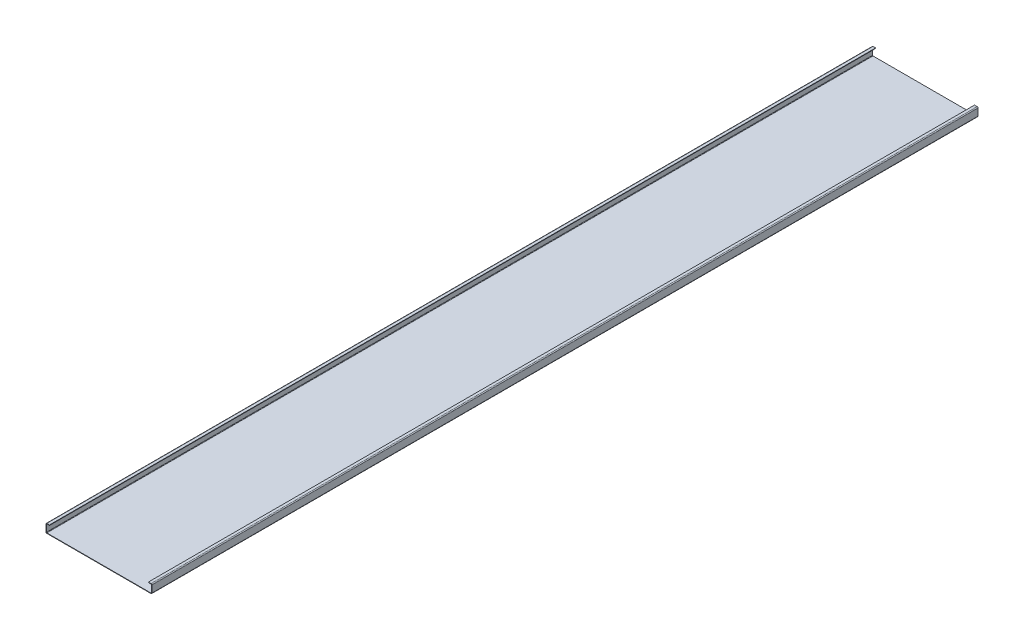
ISO-10303-21;
HEADER;
FILE_DESCRIPTION(('STEP AP214'),'2;1');
FILE_NAME('part.step','',(''),(''),'','','');
FILE_SCHEMA(('AUTOMOTIVE_DESIGN { 1 0 10303 214 1 1 1 1 }'));
ENDSEC;
DATA;
#1=APPLICATION_CONTEXT('core data for automotive mechanical design processes');
#2=APPLICATION_PROTOCOL_DEFINITION('international standard','automotive_design',2000,#1);
#3=PRODUCT_CONTEXT('',#1,'mechanical');
#4=PRODUCT('Part','Part','',(#3));
#5=PRODUCT_RELATED_PRODUCT_CATEGORY('part','',(#4));
#6=PRODUCT_DEFINITION_FORMATION('','',#4);
#7=PRODUCT_DEFINITION_CONTEXT('part definition',#1,'design');
#8=PRODUCT_DEFINITION('design','',#6,#7);
#9=PRODUCT_DEFINITION_SHAPE('','',#8);
#10=(LENGTH_UNIT() NAMED_UNIT(*) SI_UNIT(.MILLI.,.METRE.));
#11=(NAMED_UNIT(*) PLANE_ANGLE_UNIT() SI_UNIT($,.RADIAN.));
#12=(NAMED_UNIT(*) SI_UNIT($,.STERADIAN.) SOLID_ANGLE_UNIT());
#13=UNCERTAINTY_MEASURE_WITH_UNIT(LENGTH_MEASURE(1.E-05),#10,'distance_accuracy_value','');
#14=(GEOMETRIC_REPRESENTATION_CONTEXT(3) GLOBAL_UNCERTAINTY_ASSIGNED_CONTEXT((#13)) GLOBAL_UNIT_ASSIGNED_CONTEXT((#10,
#11,#12)) REPRESENTATION_CONTEXT('',''));
#15=CARTESIAN_POINT('',(0.,0.,0.));
#16=DIRECTION('',(0.,0.,1.));
#17=DIRECTION('',(1.,0.,0.));
#18=AXIS2_PLACEMENT_3D('',#15,#16,#17);
#19=CARTESIAN_POINT('',(2.5,25.,2380.));
#20=DIRECTION('',(0.,0.,1.));
#21=DIRECTION('',(1.,0.,0.));
#22=AXIS2_PLACEMENT_3D('',#19,#20,#21);
#23=PLANE('',#22);
#24=DIRECTION('',(0.,-1.,0.));
#25=VECTOR('',#24,1.);
#26=CARTESIAN_POINT('',(2.5,25.,2380.));
#27=LINE('',#26,#25);
#28=CARTESIAN_POINT('',(2.5,25.,2380.));
#29=VERTEX_POINT('',#28);
#30=CARTESIAN_POINT('',(2.5,23.75,2380.));
#31=VERTEX_POINT('',#30);
#32=EDGE_CURVE('E11',#29,#31,#27,.T.);
#33=ORIENTED_EDGE('',*,*,#32,.F.);
#34=CARTESIAN_POINT('',(2.5,22.5,2380.));
#35=DIRECTION('',(0.,0.,-1.));
#36=DIRECTION('',(-1.,0.,0.));
#37=AXIS2_PLACEMENT_3D('',#34,#35,#36);
#38=CIRCLE('',#37,2.5);
#39=CARTESIAN_POINT('',(0.,22.5,2380.));
#40=VERTEX_POINT('',#39);
#41=EDGE_CURVE('E364',#29,#40,#38,.F.);
#42=ORIENTED_EDGE('',*,*,#41,.T.);
#43=DIRECTION('',(-1.,0.,0.));
#44=VECTOR('',#43,1.);
#45=CARTESIAN_POINT('',(1.25,22.5,2380.));
#46=LINE('',#45,#44);
#47=CARTESIAN_POINT('',(1.25,22.5,2380.));
#48=VERTEX_POINT('',#47);
#49=EDGE_CURVE('E47',#48,#40,#46,.T.);
#50=ORIENTED_EDGE('',*,*,#49,.F.);
#51=CARTESIAN_POINT('',(2.5,22.5,2380.));
#52=DIRECTION('',(0.,0.,1.));
#53=DIRECTION('',(1.,0.,0.));
#54=AXIS2_PLACEMENT_3D('',#51,#52,#53);
#55=CIRCLE('',#54,1.25);
#56=EDGE_CURVE('E439',#31,#48,#55,.T.);
#57=ORIENTED_EDGE('',*,*,#56,.F.);
#58=EDGE_LOOP('',(#33,#42,#50,#57));
#59=FACE_BOUND('',#58,.T.);
#60=ADVANCED_FACE('F39',(#59),#23,.T.);
#61=CARTESIAN_POINT('',(1.25,22.5,2380.));
#62=DIRECTION('',(0.,0.,1.));
#63=DIRECTION('',(1.,0.,0.));
#64=AXIS2_PLACEMENT_3D('',#61,#62,#63);
#65=PLANE('',#64);
#66=DIRECTION('',(-1.,0.,0.));
#67=VECTOR('',#66,1.);
#68=CARTESIAN_POINT('',(10.,25.,2380.));
#69=LINE('',#68,#67);
#70=CARTESIAN_POINT('',(10.,25.,2380.));
#71=VERTEX_POINT('',#70);
#72=EDGE_CURVE('E368',#71,#29,#69,.T.);
#73=ORIENTED_EDGE('',*,*,#72,.T.);
#74=ORIENTED_EDGE('',*,*,#32,.T.);
#75=DIRECTION('',(1.,0.,0.));
#76=VECTOR('',#75,1.);
#77=CARTESIAN_POINT('',(10.,23.75,2380.));
#78=LINE('',#77,#76);
#79=CARTESIAN_POINT('',(10.,23.75,2380.));
#80=VERTEX_POINT('',#79);
#81=EDGE_CURVE('E441',#80,#31,#78,.F.);
#82=ORIENTED_EDGE('',*,*,#81,.F.);
#83=DIRECTION('',(0.,-1.,0.));
#84=VECTOR('',#83,1.);
#85=CARTESIAN_POINT('',(10.,25.,2380.));
#86=LINE('',#85,#84);
#87=EDGE_CURVE('E444',#71,#80,#86,.T.);
#88=ORIENTED_EDGE('',*,*,#87,.F.);
#89=EDGE_LOOP('',(#73,#74,#82,#88));
#90=FACE_BOUND('',#89,.T.);
#91=ADVANCED_FACE('F450',(#90),#65,.T.);
#92=CARTESIAN_POINT('',(0.,22.5,0.));
#93=DIRECTION('',(0.,0.,-1.));
#94=DIRECTION('',(-1.,0.,0.));
#95=AXIS2_PLACEMENT_3D('',#92,#93,#94);
#96=PLANE('',#95);
#97=DIRECTION('',(1.,0.,0.));
#98=VECTOR('',#97,1.);
#99=CARTESIAN_POINT('',(0.,22.5,0.));
#100=LINE('',#99,#98);
#101=CARTESIAN_POINT('',(0.,22.5,0.));
#102=VERTEX_POINT('',#101);
#103=CARTESIAN_POINT('',(1.25,22.5,0.));
#104=VERTEX_POINT('',#103);
#105=EDGE_CURVE('E348',#102,#104,#100,.T.);
#106=ORIENTED_EDGE('',*,*,#105,.F.);
#107=CARTESIAN_POINT('',(2.5,22.5,0.));
#108=DIRECTION('',(0.,0.,-1.));
#109=DIRECTION('',(-1.,0.,0.));
#110=AXIS2_PLACEMENT_3D('',#107,#108,#109);
#111=CIRCLE('',#110,2.5);
#112=CARTESIAN_POINT('',(2.5,25.,0.));
#113=VERTEX_POINT('',#112);
#114=EDGE_CURVE('E264',#113,#102,#111,.F.);
#115=ORIENTED_EDGE('',*,*,#114,.F.);
#116=DIRECTION('',(0.,1.,0.));
#117=VECTOR('',#116,1.);
#118=CARTESIAN_POINT('',(2.5,23.75,0.));
#119=LINE('',#118,#117);
#120=CARTESIAN_POINT('',(2.5,23.75,0.));
#121=VERTEX_POINT('',#120);
#122=EDGE_CURVE('E346',#121,#113,#119,.T.);
#123=ORIENTED_EDGE('',*,*,#122,.F.);
#124=CARTESIAN_POINT('',(2.5,22.5,0.));
#125=DIRECTION('',(0.,0.,1.));
#126=DIRECTION('',(1.,0.,0.));
#127=AXIS2_PLACEMENT_3D('',#124,#125,#126);
#128=CIRCLE('',#127,1.25);
#129=EDGE_CURVE('E252',#121,#104,#128,.T.);
#130=ORIENTED_EDGE('',*,*,#129,.T.);
#131=EDGE_LOOP('',(#106,#115,#123,#130));
#132=FACE_BOUND('',#131,.T.);
#133=ADVANCED_FACE('F457',(#132),#96,.T.);
#134=CARTESIAN_POINT('',(2.5,23.75,0.));
#135=DIRECTION('',(0.,0.,-1.));
#136=DIRECTION('',(-1.,0.,0.));
#137=AXIS2_PLACEMENT_3D('',#134,#135,#136);
#138=PLANE('',#137);
#139=DIRECTION('',(0.,-1.,0.));
#140=VECTOR('',#139,1.);
#141=CARTESIAN_POINT('',(0.,25.,0.));
#142=LINE('',#141,#140);
#143=CARTESIAN_POINT('',(0.,2.5,0.));
#144=VERTEX_POINT('',#143);
#145=EDGE_CURVE('E267',#102,#144,#142,.T.);
#146=ORIENTED_EDGE('',*,*,#145,.F.);
#147=ORIENTED_EDGE('',*,*,#105,.T.);
#148=DIRECTION('',(0.,1.,0.));
#149=VECTOR('',#148,1.);
#150=CARTESIAN_POINT('',(1.25,25.,0.));
#151=LINE('',#150,#149);
#152=CARTESIAN_POINT('',(1.25,2.5,0.));
#153=VERTEX_POINT('',#152);
#154=EDGE_CURVE('E249',#104,#153,#151,.F.);
#155=ORIENTED_EDGE('',*,*,#154,.T.);
#156=DIRECTION('',(-1.,0.,0.));
#157=VECTOR('',#156,1.);
#158=CARTESIAN_POINT('',(1.25,2.5,0.));
#159=LINE('',#158,#157);
#160=EDGE_CURVE('E338',#153,#144,#159,.T.);
#161=ORIENTED_EDGE('',*,*,#160,.T.);
#162=EDGE_LOOP('',(#146,#147,#155,#161));
#163=FACE_BOUND('',#162,.T.);
#164=ADVANCED_FACE('F460',(#163),#138,.T.);
#165=CARTESIAN_POINT('',(0.,2.5,2380.));
#166=DIRECTION('',(0.,0.,1.));
#167=DIRECTION('',(1.,0.,0.));
#168=AXIS2_PLACEMENT_3D('',#165,#166,#167);
#169=PLANE('',#168);
#170=DIRECTION('',(1.,0.,0.));
#171=VECTOR('',#170,1.);
#172=CARTESIAN_POINT('',(0.,2.5,2380.));
#173=LINE('',#172,#171);
#174=CARTESIAN_POINT('',(0.,2.5,2380.));
#175=VERTEX_POINT('',#174);
#176=CARTESIAN_POINT('',(1.25,2.5,2380.));
#177=VERTEX_POINT('',#176);
#178=EDGE_CURVE('E344',#175,#177,#173,.T.);
#179=ORIENTED_EDGE('',*,*,#178,.F.);
#180=CARTESIAN_POINT('',(2.5,2.5,2380.));
#181=DIRECTION('',(0.,0.,-1.));
#182=DIRECTION('',(-1.,0.,0.));
#183=AXIS2_PLACEMENT_3D('',#180,#181,#182);
#184=CIRCLE('',#183,2.5);
#185=CARTESIAN_POINT('',(2.5,0.,2380.));
#186=VERTEX_POINT('',#185);
#187=EDGE_CURVE('E376',#175,#186,#184,.F.);
#188=ORIENTED_EDGE('',*,*,#187,.T.);
#189=DIRECTION('',(0.,-1.,0.));
#190=VECTOR('',#189,1.);
#191=CARTESIAN_POINT('',(2.5,1.25,2380.));
#192=LINE('',#191,#190);
#193=CARTESIAN_POINT('',(2.5,1.25,2380.));
#194=VERTEX_POINT('',#193);
#195=EDGE_CURVE('E342',#194,#186,#192,.T.);
#196=ORIENTED_EDGE('',*,*,#195,.F.);
#197=CARTESIAN_POINT('',(2.5,2.5,2380.));
#198=DIRECTION('',(0.,0.,1.));
#199=DIRECTION('',(1.,0.,0.));
#200=AXIS2_PLACEMENT_3D('',#197,#198,#199);
#201=CIRCLE('',#200,1.25);
#202=EDGE_CURVE('E435',#177,#194,#201,.T.);
#203=ORIENTED_EDGE('',*,*,#202,.F.);
#204=EDGE_LOOP('',(#179,#188,#196,#203));
#205=FACE_BOUND('',#204,.T.);
#206=ADVANCED_FACE('F480',(#205),#169,.T.);
#207=CARTESIAN_POINT('',(2.5,1.25,2380.));
#208=DIRECTION('',(0.,0.,1.));
#209=DIRECTION('',(1.,0.,0.));
#210=AXIS2_PLACEMENT_3D('',#207,#208,#209);
#211=PLANE('',#210);
#212=DIRECTION('',(0.,-1.,0.));
#213=VECTOR('',#212,1.);
#214=CARTESIAN_POINT('',(0.,25.,2380.));
#215=LINE('',#214,#213);
#216=EDGE_CURVE('E355',#40,#175,#215,.T.);
#217=ORIENTED_EDGE('',*,*,#216,.T.);
#218=ORIENTED_EDGE('',*,*,#178,.T.);
#219=DIRECTION('',(0.,1.,0.));
#220=VECTOR('',#219,1.);
#221=CARTESIAN_POINT('',(1.25,25.,2380.));
#222=LINE('',#221,#220);
#223=EDGE_CURVE('E358',#48,#177,#222,.F.);
#224=ORIENTED_EDGE('',*,*,#223,.F.);
#225=ORIENTED_EDGE('',*,*,#49,.T.);
#226=EDGE_LOOP('',(#217,#218,#224,#225));
#227=FACE_BOUND('',#226,.T.);
#228=ADVANCED_FACE('F353',(#227),#211,.T.);
#229=CARTESIAN_POINT('',(2.5,0.,0.));
#230=DIRECTION('',(0.,0.,-1.));
#231=DIRECTION('',(-1.,0.,0.));
#232=AXIS2_PLACEMENT_3D('',#229,#230,#231);
#233=PLANE('',#232);
#234=DIRECTION('',(0.,1.,0.));
#235=VECTOR('',#234,1.);
#236=CARTESIAN_POINT('',(2.5,0.,0.));
#237=LINE('',#236,#235);
#238=CARTESIAN_POINT('',(2.5,0.,0.));
#239=VERTEX_POINT('',#238);
#240=CARTESIAN_POINT('',(2.5,1.25,0.));
#241=VERTEX_POINT('',#240);
#242=EDGE_CURVE('E340',#239,#241,#237,.T.);
#243=ORIENTED_EDGE('',*,*,#242,.F.);
#244=CARTESIAN_POINT('',(2.5,2.5,0.));
#245=DIRECTION('',(0.,0.,-1.));
#246=DIRECTION('',(-1.,0.,0.));
#247=AXIS2_PLACEMENT_3D('',#244,#245,#246);
#248=CIRCLE('',#247,2.5);
#249=EDGE_CURVE('E270',#144,#239,#248,.F.);
#250=ORIENTED_EDGE('',*,*,#249,.F.);
#251=ORIENTED_EDGE('',*,*,#160,.F.);
#252=CARTESIAN_POINT('',(2.5,2.5,0.));
#253=DIRECTION('',(0.,0.,1.));
#254=DIRECTION('',(1.,0.,0.));
#255=AXIS2_PLACEMENT_3D('',#252,#253,#254);
#256=CIRCLE('',#255,1.25);
#257=EDGE_CURVE('E246',#153,#241,#256,.T.);
#258=ORIENTED_EDGE('',*,*,#257,.T.);
#259=EDGE_LOOP('',(#243,#250,#251,#258));
#260=FACE_BOUND('',#259,.T.);
#261=ADVANCED_FACE('F474',(#260),#233,.T.);
#262=CARTESIAN_POINT('',(1.25,2.5,0.));
#263=DIRECTION('',(0.,0.,-1.));
#264=DIRECTION('',(-1.,0.,0.));
#265=AXIS2_PLACEMENT_3D('',#262,#263,#264);
#266=PLANE('',#265);
#267=DIRECTION('',(1.,0.,0.));
#268=VECTOR('',#267,1.);
#269=CARTESIAN_POINT('',(0.,0.,0.));
#270=LINE('',#269,#268);
#271=CARTESIAN_POINT('',(302.5,0.,0.));
#272=VERTEX_POINT('',#271);
#273=EDGE_CURVE('E273',#239,#272,#270,.T.);
#274=ORIENTED_EDGE('',*,*,#273,.F.);
#275=ORIENTED_EDGE('',*,*,#242,.T.);
#276=DIRECTION('',(1.,0.,0.));
#277=VECTOR('',#276,1.);
#278=CARTESIAN_POINT('',(0.,1.25,0.));
#279=LINE('',#278,#277);
#280=CARTESIAN_POINT('',(302.5,1.25,0.));
#281=VERTEX_POINT('',#280);
#282=EDGE_CURVE('E243',#241,#281,#279,.T.);
#283=ORIENTED_EDGE('',*,*,#282,.T.);
#284=DIRECTION('',(0.,-1.,0.));
#285=VECTOR('',#284,1.);
#286=CARTESIAN_POINT('',(302.5,1.25,0.));
#287=LINE('',#286,#285);
#288=EDGE_CURVE('E334',#281,#272,#287,.T.);
#289=ORIENTED_EDGE('',*,*,#288,.T.);
#290=EDGE_LOOP('',(#274,#275,#283,#289));
#291=FACE_BOUND('',#290,.T.);
#292=ADVANCED_FACE('F484',(#291),#266,.T.);
#293=CARTESIAN_POINT('',(302.5,0.,2380.));
#294=DIRECTION('',(0.,0.,1.));
#295=DIRECTION('',(1.,0.,0.));
#296=AXIS2_PLACEMENT_3D('',#293,#294,#295);
#297=PLANE('',#296);
#298=DIRECTION('',(0.,1.,0.));
#299=VECTOR('',#298,1.);
#300=CARTESIAN_POINT('',(302.5,0.,2380.));
#301=LINE('',#300,#299);
#302=CARTESIAN_POINT('',(302.5,0.,2380.));
#303=VERTEX_POINT('',#302);
#304=CARTESIAN_POINT('',(302.5,1.25,2380.));
#305=VERTEX_POINT('',#304);
#306=EDGE_CURVE('E196',#303,#305,#301,.T.);
#307=ORIENTED_EDGE('',*,*,#306,.F.);
#308=CARTESIAN_POINT('',(302.5,2.5,2380.));
#309=DIRECTION('',(0.,0.,-1.));
#310=DIRECTION('',(-1.,0.,0.));
#311=AXIS2_PLACEMENT_3D('',#308,#309,#310);
#312=CIRCLE('',#311,2.5);
#313=CARTESIAN_POINT('',(305.,2.5,2380.));
#314=VERTEX_POINT('',#313);
#315=EDGE_CURVE('E200',#303,#314,#312,.F.);
#316=ORIENTED_EDGE('',*,*,#315,.T.);
#317=DIRECTION('',(1.,0.,0.));
#318=VECTOR('',#317,1.);
#319=CARTESIAN_POINT('',(303.75,2.5,2380.));
#320=LINE('',#319,#318);
#321=CARTESIAN_POINT('',(303.75,2.5,2380.));
#322=VERTEX_POINT('',#321);
#323=EDGE_CURVE('E184',#322,#314,#320,.T.);
#324=ORIENTED_EDGE('',*,*,#323,.F.);
#325=CARTESIAN_POINT('',(302.5,2.5,2380.));
#326=DIRECTION('',(0.,0.,1.));
#327=DIRECTION('',(1.,0.,0.));
#328=AXIS2_PLACEMENT_3D('',#325,#326,#327);
#329=CIRCLE('',#328,1.25);
#330=EDGE_CURVE('E397',#305,#322,#329,.T.);
#331=ORIENTED_EDGE('',*,*,#330,.F.);
#332=EDGE_LOOP('',(#307,#316,#324,#331));
#333=FACE_BOUND('',#332,.T.);
#334=ADVANCED_FACE('F202',(#333),#297,.T.);
#335=CARTESIAN_POINT('',(303.75,2.5,2380.));
#336=DIRECTION('',(0.,0.,1.));
#337=DIRECTION('',(1.,0.,0.));
#338=AXIS2_PLACEMENT_3D('',#335,#336,#337);
#339=PLANE('',#338);
#340=DIRECTION('',(1.,0.,0.));
#341=VECTOR('',#340,1.);
#342=CARTESIAN_POINT('',(0.,0.,2380.));
#343=LINE('',#342,#341);
#344=EDGE_CURVE('E206',#186,#303,#343,.T.);
#345=ORIENTED_EDGE('',*,*,#344,.T.);
#346=ORIENTED_EDGE('',*,*,#306,.T.);
#347=DIRECTION('',(1.,0.,0.));
#348=VECTOR('',#347,1.);
#349=CARTESIAN_POINT('',(0.,1.25,2380.));
#350=LINE('',#349,#348);
#351=EDGE_CURVE('E432',#194,#305,#350,.T.);
#352=ORIENTED_EDGE('',*,*,#351,.F.);
#353=ORIENTED_EDGE('',*,*,#195,.T.);
#354=EDGE_LOOP('',(#345,#346,#352,#353));
#355=FACE_BOUND('',#354,.T.);
#356=ADVANCED_FACE('F384',(#355),#339,.T.);
#357=CARTESIAN_POINT('',(305.,2.5,0.));
#358=DIRECTION('',(0.,0.,-1.));
#359=DIRECTION('',(-1.,0.,0.));
#360=AXIS2_PLACEMENT_3D('',#357,#358,#359);
#361=PLANE('',#360);
#362=DIRECTION('',(-1.,0.,0.));
#363=VECTOR('',#362,1.);
#364=CARTESIAN_POINT('',(305.,2.5,0.));
#365=LINE('',#364,#363);
#366=CARTESIAN_POINT('',(305.,2.5,0.));
#367=VERTEX_POINT('',#366);
#368=CARTESIAN_POINT('',(303.75,2.5,0.));
#369=VERTEX_POINT('',#368);
#370=EDGE_CURVE('E197',#367,#369,#365,.T.);
#371=ORIENTED_EDGE('',*,*,#370,.F.);
#372=CARTESIAN_POINT('',(302.5,2.5,0.));
#373=DIRECTION('',(0.,0.,-1.));
#374=DIRECTION('',(-1.,0.,0.));
#375=AXIS2_PLACEMENT_3D('',#372,#373,#374);
#376=CIRCLE('',#375,2.5);
#377=EDGE_CURVE('E213',#272,#367,#376,.F.);
#378=ORIENTED_EDGE('',*,*,#377,.F.);
#379=ORIENTED_EDGE('',*,*,#288,.F.);
#380=CARTESIAN_POINT('',(302.5,2.5,0.));
#381=DIRECTION('',(0.,0.,1.));
#382=DIRECTION('',(1.,0.,0.));
#383=AXIS2_PLACEMENT_3D('',#380,#381,#382);
#384=CIRCLE('',#383,1.25);
#385=EDGE_CURVE('E240',#281,#369,#384,.T.);
#386=ORIENTED_EDGE('',*,*,#385,.T.);
#387=EDGE_LOOP('',(#371,#378,#379,#386));
#388=FACE_BOUND('',#387,.T.);
#389=ADVANCED_FACE('F391',(#388),#361,.T.);
#390=CARTESIAN_POINT('',(302.5,1.25,0.));
#391=DIRECTION('',(0.,0.,-1.));
#392=DIRECTION('',(-1.,0.,0.));
#393=AXIS2_PLACEMENT_3D('',#390,#391,#392);
#394=PLANE('',#393);
#395=DIRECTION('',(0.,1.,0.));
#396=VECTOR('',#395,1.);
#397=CARTESIAN_POINT('',(305.,0.,0.));
#398=LINE('',#397,#396);
#399=CARTESIAN_POINT('',(305.,22.5,0.));
#400=VERTEX_POINT('',#399);
#401=EDGE_CURVE('E277',#367,#400,#398,.T.);
#402=ORIENTED_EDGE('',*,*,#401,.F.);
#403=ORIENTED_EDGE('',*,*,#370,.T.);
#404=DIRECTION('',(0.,1.,0.));
#405=VECTOR('',#404,1.);
#406=CARTESIAN_POINT('',(303.75,0.,0.));
#407=LINE('',#406,#405);
#408=CARTESIAN_POINT('',(303.75,22.5,0.));
#409=VERTEX_POINT('',#408);
#410=EDGE_CURVE('E238',#369,#409,#407,.T.);
#411=ORIENTED_EDGE('',*,*,#410,.T.);
#412=DIRECTION('',(1.,0.,0.));
#413=VECTOR('',#412,1.);
#414=CARTESIAN_POINT('',(303.75,22.5,0.));
#415=LINE('',#414,#413);
#416=EDGE_CURVE('E120',#409,#400,#415,.T.);
#417=ORIENTED_EDGE('',*,*,#416,.T.);
#418=EDGE_LOOP('',(#402,#403,#411,#417));
#419=FACE_BOUND('',#418,.T.);
#420=ADVANCED_FACE('F393',(#419),#394,.T.);
#421=CARTESIAN_POINT('',(305.,22.5,2380.));
#422=DIRECTION('',(0.,0.,1.));
#423=DIRECTION('',(1.,0.,0.));
#424=AXIS2_PLACEMENT_3D('',#421,#422,#423);
#425=PLANE('',#424);
#426=DIRECTION('',(-1.,0.,0.));
#427=VECTOR('',#426,1.);
#428=CARTESIAN_POINT('',(305.,22.5,2380.));
#429=LINE('',#428,#427);
#430=CARTESIAN_POINT('',(305.,22.5,2380.));
#431=VERTEX_POINT('',#430);
#432=CARTESIAN_POINT('',(303.75,22.5,2380.));
#433=VERTEX_POINT('',#432);
#434=EDGE_CURVE('E332',#431,#433,#429,.T.);
#435=ORIENTED_EDGE('',*,*,#434,.F.);
#436=CARTESIAN_POINT('',(302.5,22.5,2380.));
#437=DIRECTION('',(0.,0.,-1.));
#438=DIRECTION('',(-1.,0.,0.));
#439=AXIS2_PLACEMENT_3D('',#436,#437,#438);
#440=CIRCLE('',#439,2.5);
#441=CARTESIAN_POINT('',(302.5,25.,2380.));
#442=VERTEX_POINT('',#441);
#443=EDGE_CURVE('E221',#431,#442,#440,.F.);
#444=ORIENTED_EDGE('',*,*,#443,.T.);
#445=DIRECTION('',(0.,1.,0.));
#446=VECTOR('',#445,1.);
#447=CARTESIAN_POINT('',(302.5,23.75,2380.));
#448=LINE('',#447,#446);
#449=CARTESIAN_POINT('',(302.5,23.75,2380.));
#450=VERTEX_POINT('',#449);
#451=EDGE_CURVE('E55',#450,#442,#448,.T.);
#452=ORIENTED_EDGE('',*,*,#451,.F.);
#453=CARTESIAN_POINT('',(302.5,22.5,2380.));
#454=DIRECTION('',(0.,0.,1.));
#455=DIRECTION('',(1.,0.,0.));
#456=AXIS2_PLACEMENT_3D('',#453,#454,#455);
#457=CIRCLE('',#456,1.25);
#458=EDGE_CURVE('E425',#433,#450,#457,.T.);
#459=ORIENTED_EDGE('',*,*,#458,.F.);
#460=EDGE_LOOP('',(#435,#444,#452,#459));
#461=FACE_BOUND('',#460,.T.);
#462=ADVANCED_FACE('F555',(#461),#425,.T.);
#463=CARTESIAN_POINT('',(302.5,23.75,2380.));
#464=DIRECTION('',(0.,0.,1.));
#465=DIRECTION('',(1.,0.,0.));
#466=AXIS2_PLACEMENT_3D('',#463,#464,#465);
#467=PLANE('',#466);
#468=DIRECTION('',(0.,1.,0.));
#469=VECTOR('',#468,1.);
#470=CARTESIAN_POINT('',(305.,0.,2380.));
#471=LINE('',#470,#469);
#472=EDGE_CURVE('E188',#314,#431,#471,.T.);
#473=ORIENTED_EDGE('',*,*,#472,.T.);
#474=ORIENTED_EDGE('',*,*,#434,.T.);
#475=DIRECTION('',(0.,1.,0.));
#476=VECTOR('',#475,1.);
#477=CARTESIAN_POINT('',(303.75,0.,2380.));
#478=LINE('',#477,#476);
#479=EDGE_CURVE('E191',#322,#433,#478,.T.);
#480=ORIENTED_EDGE('',*,*,#479,.F.);
#481=ORIENTED_EDGE('',*,*,#323,.T.);
#482=EDGE_LOOP('',(#473,#474,#480,#481));
#483=FACE_BOUND('',#482,.T.);
#484=ADVANCED_FACE('F186',(#483),#467,.T.);
#485=CARTESIAN_POINT('',(302.5,25.,0.));
#486=DIRECTION('',(0.,0.,-1.));
#487=DIRECTION('',(-1.,0.,0.));
#488=AXIS2_PLACEMENT_3D('',#485,#486,#487);
#489=PLANE('',#488);
#490=DIRECTION('',(0.,-1.,0.));
#491=VECTOR('',#490,1.);
#492=CARTESIAN_POINT('',(302.5,25.,0.));
#493=LINE('',#492,#491);
#494=CARTESIAN_POINT('',(302.5,25.,0.));
#495=VERTEX_POINT('',#494);
#496=CARTESIAN_POINT('',(302.5,23.75,0.));
#497=VERTEX_POINT('',#496);
#498=EDGE_CURVE('E127',#495,#497,#493,.T.);
#499=ORIENTED_EDGE('',*,*,#498,.F.);
#500=CARTESIAN_POINT('',(302.5,22.5,0.));
#501=DIRECTION('',(0.,0.,-1.));
#502=DIRECTION('',(-1.,0.,0.));
#503=AXIS2_PLACEMENT_3D('',#500,#501,#502);
#504=CIRCLE('',#503,2.5);
#505=EDGE_CURVE('E279',#400,#495,#504,.F.);
#506=ORIENTED_EDGE('',*,*,#505,.F.);
#507=ORIENTED_EDGE('',*,*,#416,.F.);
#508=CARTESIAN_POINT('',(302.5,22.5,0.));
#509=DIRECTION('',(0.,0.,1.));
#510=DIRECTION('',(1.,0.,0.));
#511=AXIS2_PLACEMENT_3D('',#508,#509,#510);
#512=CIRCLE('',#511,1.25);
#513=EDGE_CURVE('E236',#409,#497,#512,.T.);
#514=ORIENTED_EDGE('',*,*,#513,.T.);
#515=EDGE_LOOP('',(#499,#506,#507,#514));
#516=FACE_BOUND('',#515,.T.);
#517=ADVANCED_FACE('F408',(#516),#489,.T.);
#518=CARTESIAN_POINT('',(303.75,22.5,0.));
#519=DIRECTION('',(0.,0.,-1.));
#520=DIRECTION('',(-1.,0.,0.));
#521=AXIS2_PLACEMENT_3D('',#518,#519,#520);
#522=PLANE('',#521);
#523=DIRECTION('',(-1.,0.,0.));
#524=VECTOR('',#523,1.);
#525=CARTESIAN_POINT('',(305.,25.,0.));
#526=LINE('',#525,#524);
#527=CARTESIAN_POINT('',(295.,25.,0.));
#528=VERTEX_POINT('',#527);
#529=EDGE_CURVE('E227',#495,#528,#526,.T.);
#530=ORIENTED_EDGE('',*,*,#529,.F.);
#531=ORIENTED_EDGE('',*,*,#498,.T.);
#532=DIRECTION('',(1.,0.,0.));
#533=VECTOR('',#532,1.);
#534=CARTESIAN_POINT('',(305.,23.75,0.));
#535=LINE('',#534,#533);
#536=CARTESIAN_POINT('',(295.,23.75,0.));
#537=VERTEX_POINT('',#536);
#538=EDGE_CURVE('E233',#497,#537,#535,.F.);
#539=ORIENTED_EDGE('',*,*,#538,.T.);
#540=DIRECTION('',(0.,1.,0.));
#541=VECTOR('',#540,1.);
#542=CARTESIAN_POINT('',(295.,23.75,0.));
#543=LINE('',#542,#541);
#544=EDGE_CURVE('E230',#537,#528,#543,.T.);
#545=ORIENTED_EDGE('',*,*,#544,.T.);
#546=EDGE_LOOP('',(#530,#531,#539,#545));
#547=FACE_BOUND('',#546,.T.);
#548=ADVANCED_FACE('F416',(#547),#522,.T.);
#549=CARTESIAN_POINT('',(305.,25.,2380.));
#550=DIRECTION('',(0.,-1.,0.));
#551=DIRECTION('',(0.,0.,-1.));
#552=AXIS2_PLACEMENT_3D('',#549,#550,#551);
#553=PLANE('',#552);
#554=ORIENTED_EDGE('',*,*,#529,.T.);
#555=DIRECTION('',(0.,0.,-1.));
#556=VECTOR('',#555,1.);
#557=CARTESIAN_POINT('',(295.,25.,2380.));
#558=LINE('',#557,#556);
#559=CARTESIAN_POINT('',(295.,25.,2380.));
#560=VERTEX_POINT('',#559);
#561=EDGE_CURVE('E327',#560,#528,#558,.T.);
#562=ORIENTED_EDGE('',*,*,#561,.F.);
#563=DIRECTION('',(-1.,0.,0.));
#564=VECTOR('',#563,1.);
#565=CARTESIAN_POINT('',(305.,25.,2380.));
#566=LINE('',#565,#564);
#567=EDGE_CURVE('E133',#442,#560,#566,.T.);
#568=ORIENTED_EDGE('',*,*,#567,.F.);
#569=DIRECTION('',(0.,0.,-1.));
#570=VECTOR('',#569,1.);
#571=CARTESIAN_POINT('',(302.5,25.,2380.));
#572=LINE('',#571,#570);
#573=EDGE_CURVE('E223',#442,#495,#572,.T.);
#574=ORIENTED_EDGE('',*,*,#573,.T.);
#575=EDGE_LOOP('',(#554,#562,#568,#574));
#576=FACE_BOUND('',#575,.T.);
#577=ADVANCED_FACE('F414',(#576),#553,.F.);
#578=CARTESIAN_POINT('',(295.,23.75,2380.));
#579=DIRECTION('',(-1.,0.,0.));
#580=DIRECTION('',(0.,0.,1.));
#581=AXIS2_PLACEMENT_3D('',#578,#579,#580);
#582=PLANE('',#581);
#583=ORIENTED_EDGE('',*,*,#544,.F.);
#584=DIRECTION('',(0.,0.,-1.));
#585=VECTOR('',#584,1.);
#586=CARTESIAN_POINT('',(295.,23.75,2380.));
#587=LINE('',#586,#585);
#588=CARTESIAN_POINT('',(295.,23.75,2380.));
#589=VERTEX_POINT('',#588);
#590=EDGE_CURVE('E325',#589,#537,#587,.T.);
#591=ORIENTED_EDGE('',*,*,#590,.F.);
#592=DIRECTION('',(0.,1.,0.));
#593=VECTOR('',#592,1.);
#594=CARTESIAN_POINT('',(295.,23.75,2380.));
#595=LINE('',#594,#593);
#596=EDGE_CURVE('E421',#589,#560,#595,.T.);
#597=ORIENTED_EDGE('',*,*,#596,.T.);
#598=ORIENTED_EDGE('',*,*,#561,.T.);
#599=EDGE_LOOP('',(#583,#591,#597,#598));
#600=FACE_BOUND('',#599,.T.);
#601=ADVANCED_FACE('F419',(#600),#582,.T.);
#602=CARTESIAN_POINT('',(305.,23.75,2380.));
#603=DIRECTION('',(0.,-1.,0.));
#604=DIRECTION('',(0.,0.,-1.));
#605=AXIS2_PLACEMENT_3D('',#602,#603,#604);
#606=PLANE('',#605);
#607=ORIENTED_EDGE('',*,*,#538,.F.);
#608=DIRECTION('',(0.,0.,-1.));
#609=VECTOR('',#608,1.);
#610=CARTESIAN_POINT('',(302.5,23.75,2380.));
#611=LINE('',#610,#609);
#612=EDGE_CURVE('E322',#450,#497,#611,.T.);
#613=ORIENTED_EDGE('',*,*,#612,.F.);
#614=DIRECTION('',(1.,0.,0.));
#615=VECTOR('',#614,1.);
#616=CARTESIAN_POINT('',(305.,23.75,2380.));
#617=LINE('',#616,#615);
#618=EDGE_CURVE('E423',#450,#589,#617,.F.);
#619=ORIENTED_EDGE('',*,*,#618,.T.);
#620=ORIENTED_EDGE('',*,*,#590,.T.);
#621=EDGE_LOOP('',(#607,#613,#619,#620));
#622=FACE_BOUND('',#621,.T.);
#623=ADVANCED_FACE('F611',(#622),#606,.T.);
#624=CARTESIAN_POINT('',(302.5,22.5,2380.));
#625=DIRECTION('',(0.,0.,-1.));
#626=DIRECTION('',(-1.,0.,0.));
#627=AXIS2_PLACEMENT_3D('',#624,#625,#626);
#628=CYLINDRICAL_SURFACE('',#627,1.25);
#629=ORIENTED_EDGE('',*,*,#513,.F.);
#630=DIRECTION('',(0.,0.,-1.));
#631=VECTOR('',#630,1.);
#632=CARTESIAN_POINT('',(303.75,22.5,2380.));
#633=LINE('',#632,#631);
#634=EDGE_CURVE('E319',#433,#409,#633,.T.);
#635=ORIENTED_EDGE('',*,*,#634,.F.);
#636=ORIENTED_EDGE('',*,*,#458,.T.);
#637=ORIENTED_EDGE('',*,*,#612,.T.);
#638=EDGE_LOOP('',(#629,#635,#636,#637));
#639=FACE_BOUND('',#638,.T.);
#640=ADVANCED_FACE('F405',(#639),#628,.F.);
#641=CARTESIAN_POINT('',(303.75,0.,2380.));
#642=DIRECTION('',(-1.,0.,0.));
#643=DIRECTION('',(0.,0.,1.));
#644=AXIS2_PLACEMENT_3D('',#641,#642,#643);
#645=PLANE('',#644);
#646=ORIENTED_EDGE('',*,*,#410,.F.);
#647=DIRECTION('',(0.,0.,-1.));
#648=VECTOR('',#647,1.);
#649=CARTESIAN_POINT('',(303.75,2.5,2380.));
#650=LINE('',#649,#648);
#651=EDGE_CURVE('E316',#322,#369,#650,.T.);
#652=ORIENTED_EDGE('',*,*,#651,.F.);
#653=ORIENTED_EDGE('',*,*,#479,.T.);
#654=ORIENTED_EDGE('',*,*,#634,.T.);
#655=EDGE_LOOP('',(#646,#652,#653,#654));
#656=FACE_BOUND('',#655,.T.);
#657=ADVANCED_FACE('F399',(#656),#645,.T.);
#658=CARTESIAN_POINT('',(302.5,2.5,2380.));
#659=DIRECTION('',(0.,0.,-1.));
#660=DIRECTION('',(-1.,0.,0.));
#661=AXIS2_PLACEMENT_3D('',#658,#659,#660);
#662=CYLINDRICAL_SURFACE('',#661,1.25);
#663=ORIENTED_EDGE('',*,*,#385,.F.);
#664=DIRECTION('',(0.,0.,-1.));
#665=VECTOR('',#664,1.);
#666=CARTESIAN_POINT('',(302.5,1.25,2380.));
#667=LINE('',#666,#665);
#668=EDGE_CURVE('E313',#305,#281,#667,.T.);
#669=ORIENTED_EDGE('',*,*,#668,.F.);
#670=ORIENTED_EDGE('',*,*,#330,.T.);
#671=ORIENTED_EDGE('',*,*,#651,.T.);
#672=EDGE_LOOP('',(#663,#669,#670,#671));
#673=FACE_BOUND('',#672,.T.);
#674=ADVANCED_FACE('F396',(#673),#662,.F.);
#675=CARTESIAN_POINT('',(0.,1.25,2380.));
#676=DIRECTION('',(0.,1.,0.));
#677=DIRECTION('',(0.,0.,1.));
#678=AXIS2_PLACEMENT_3D('',#675,#676,#677);
#679=PLANE('',#678);
#680=ORIENTED_EDGE('',*,*,#282,.F.);
#681=DIRECTION('',(0.,0.,-1.));
#682=VECTOR('',#681,1.);
#683=CARTESIAN_POINT('',(2.5,1.25,2380.));
#684=LINE('',#683,#682);
#685=EDGE_CURVE('E310',#194,#241,#684,.T.);
#686=ORIENTED_EDGE('',*,*,#685,.F.);
#687=ORIENTED_EDGE('',*,*,#351,.T.);
#688=ORIENTED_EDGE('',*,*,#668,.T.);
#689=EDGE_LOOP('',(#680,#686,#687,#688));
#690=FACE_BOUND('',#689,.T.);
#691=ADVANCED_FACE('F482',(#690),#679,.T.);
#692=CARTESIAN_POINT('',(2.5,2.5,2380.));
#693=DIRECTION('',(0.,0.,-1.));
#694=DIRECTION('',(-1.,0.,0.));
#695=AXIS2_PLACEMENT_3D('',#692,#693,#694);
#696=CYLINDRICAL_SURFACE('',#695,1.25);
#697=ORIENTED_EDGE('',*,*,#257,.F.);
#698=DIRECTION('',(0.,0.,-1.));
#699=VECTOR('',#698,1.);
#700=CARTESIAN_POINT('',(1.25,2.5,2380.));
#701=LINE('',#700,#699);
#702=EDGE_CURVE('E307',#177,#153,#701,.T.);
#703=ORIENTED_EDGE('',*,*,#702,.F.);
#704=ORIENTED_EDGE('',*,*,#202,.T.);
#705=ORIENTED_EDGE('',*,*,#685,.T.);
#706=EDGE_LOOP('',(#697,#703,#704,#705));
#707=FACE_BOUND('',#706,.T.);
#708=ADVANCED_FACE('F470',(#707),#696,.F.);
#709=CARTESIAN_POINT('',(1.25,25.,2380.));
#710=DIRECTION('',(1.,0.,0.));
#711=DIRECTION('',(0.,0.,-1.));
#712=AXIS2_PLACEMENT_3D('',#709,#710,#711);
#713=PLANE('',#712);
#714=ORIENTED_EDGE('',*,*,#154,.F.);
#715=DIRECTION('',(0.,0.,-1.));
#716=VECTOR('',#715,1.);
#717=CARTESIAN_POINT('',(1.25,22.5,2380.));
#718=LINE('',#717,#716);
#719=EDGE_CURVE('E304',#48,#104,#718,.T.);
#720=ORIENTED_EDGE('',*,*,#719,.F.);
#721=ORIENTED_EDGE('',*,*,#223,.T.);
#722=ORIENTED_EDGE('',*,*,#702,.T.);
#723=EDGE_LOOP('',(#714,#720,#721,#722));
#724=FACE_BOUND('',#723,.T.);
#725=ADVANCED_FACE('F465',(#724),#713,.T.);
#726=CARTESIAN_POINT('',(2.5,22.5,2380.));
#727=DIRECTION('',(0.,0.,-1.));
#728=DIRECTION('',(-1.,0.,0.));
#729=AXIS2_PLACEMENT_3D('',#726,#727,#728);
#730=CYLINDRICAL_SURFACE('',#729,1.25);
#731=ORIENTED_EDGE('',*,*,#129,.F.);
#732=DIRECTION('',(0.,0.,-1.));
#733=VECTOR('',#732,1.);
#734=CARTESIAN_POINT('',(2.5,23.75,2380.));
#735=LINE('',#734,#733);
#736=EDGE_CURVE('E301',#31,#121,#735,.T.);
#737=ORIENTED_EDGE('',*,*,#736,.F.);
#738=ORIENTED_EDGE('',*,*,#56,.T.);
#739=ORIENTED_EDGE('',*,*,#719,.T.);
#740=EDGE_LOOP('',(#731,#737,#738,#739));
#741=FACE_BOUND('',#740,.T.);
#742=ADVANCED_FACE('F463',(#741),#730,.F.);
#743=CARTESIAN_POINT('',(10.,23.75,2380.));
#744=DIRECTION('',(0.,-1.,0.));
#745=DIRECTION('',(0.,0.,-1.));
#746=AXIS2_PLACEMENT_3D('',#743,#744,#745);
#747=PLANE('',#746);
#748=DIRECTION('',(1.,0.,0.));
#749=VECTOR('',#748,1.);
#750=CARTESIAN_POINT('',(10.,23.75,0.));
#751=LINE('',#750,#749);
#752=CARTESIAN_POINT('',(10.,23.75,0.));
#753=VERTEX_POINT('',#752);
#754=EDGE_CURVE('E255',#753,#121,#751,.F.);
#755=ORIENTED_EDGE('',*,*,#754,.F.);
#756=DIRECTION('',(0.,0.,-1.));
#757=VECTOR('',#756,1.);
#758=CARTESIAN_POINT('',(10.,23.75,2380.));
#759=LINE('',#758,#757);
#760=EDGE_CURVE('E299',#80,#753,#759,.T.);
#761=ORIENTED_EDGE('',*,*,#760,.F.);
#762=ORIENTED_EDGE('',*,*,#81,.T.);
#763=ORIENTED_EDGE('',*,*,#736,.T.);
#764=EDGE_LOOP('',(#755,#761,#762,#763));
#765=FACE_BOUND('',#764,.T.);
#766=ADVANCED_FACE('F685',(#765),#747,.T.);
#767=CARTESIAN_POINT('',(10.,25.,2380.));
#768=DIRECTION('',(1.,0.,0.));
#769=DIRECTION('',(0.,0.,-1.));
#770=AXIS2_PLACEMENT_3D('',#767,#768,#769);
#771=PLANE('',#770);
#772=DIRECTION('',(0.,-1.,0.));
#773=VECTOR('',#772,1.);
#774=CARTESIAN_POINT('',(10.,25.,0.));
#775=LINE('',#774,#773);
#776=CARTESIAN_POINT('',(10.,25.,0.));
#777=VERTEX_POINT('',#776);
#778=EDGE_CURVE('E258',#777,#753,#775,.T.);
#779=ORIENTED_EDGE('',*,*,#778,.F.);
#780=DIRECTION('',(0.,0.,-1.));
#781=VECTOR('',#780,1.);
#782=CARTESIAN_POINT('',(10.,25.,2380.));
#783=LINE('',#782,#781);
#784=EDGE_CURVE('E297',#71,#777,#783,.T.);
#785=ORIENTED_EDGE('',*,*,#784,.F.);
#786=ORIENTED_EDGE('',*,*,#87,.T.);
#787=ORIENTED_EDGE('',*,*,#760,.T.);
#788=EDGE_LOOP('',(#779,#785,#786,#787));
#789=FACE_BOUND('',#788,.T.);
#790=ADVANCED_FACE('F695',(#789),#771,.T.);
#791=CARTESIAN_POINT('',(10.,25.,2380.));
#792=DIRECTION('',(0.,-1.,0.));
#793=DIRECTION('',(0.,0.,-1.));
#794=AXIS2_PLACEMENT_3D('',#791,#792,#793);
#795=PLANE('',#794);
#796=DIRECTION('',(-1.,0.,0.));
#797=VECTOR('',#796,1.);
#798=CARTESIAN_POINT('',(10.,25.,0.));
#799=LINE('',#798,#797);
#800=EDGE_CURVE('E261',#777,#113,#799,.T.);
#801=ORIENTED_EDGE('',*,*,#800,.T.);
#802=DIRECTION('',(0.,0.,-1.));
#803=VECTOR('',#802,1.);
#804=CARTESIAN_POINT('',(2.5,25.,2380.));
#805=LINE('',#804,#803);
#806=EDGE_CURVE('E294',#29,#113,#805,.T.);
#807=ORIENTED_EDGE('',*,*,#806,.F.);
#808=ORIENTED_EDGE('',*,*,#72,.F.);
#809=ORIENTED_EDGE('',*,*,#784,.T.);
#810=EDGE_LOOP('',(#801,#807,#808,#809));
#811=FACE_BOUND('',#810,.T.);
#812=ADVANCED_FACE('F454',(#811),#795,.F.);
#813=CARTESIAN_POINT('',(2.5,22.5,2380.));
#814=DIRECTION('',(0.,0.,-1.));
#815=DIRECTION('',(-1.,0.,0.));
#816=AXIS2_PLACEMENT_3D('',#813,#814,#815);
#817=CYLINDRICAL_SURFACE('',#816,2.5);
#818=ORIENTED_EDGE('',*,*,#114,.T.);
#819=DIRECTION('',(0.,0.,-1.));
#820=VECTOR('',#819,1.);
#821=CARTESIAN_POINT('',(0.,22.5,2380.));
#822=LINE('',#821,#820);
#823=EDGE_CURVE('E291',#40,#102,#822,.T.);
#824=ORIENTED_EDGE('',*,*,#823,.F.);
#825=ORIENTED_EDGE('',*,*,#41,.F.);
#826=ORIENTED_EDGE('',*,*,#806,.T.);
#827=EDGE_LOOP('',(#818,#824,#825,#826));
#828=FACE_BOUND('',#827,.T.);
#829=ADVANCED_FACE('F370',(#828),#817,.T.);
#830=CARTESIAN_POINT('',(0.,25.,2380.));
#831=DIRECTION('',(1.,0.,0.));
#832=DIRECTION('',(0.,0.,-1.));
#833=AXIS2_PLACEMENT_3D('',#830,#831,#832);
#834=PLANE('',#833);
#835=ORIENTED_EDGE('',*,*,#145,.T.);
#836=DIRECTION('',(0.,0.,-1.));
#837=VECTOR('',#836,1.);
#838=CARTESIAN_POINT('',(0.,2.5,2380.));
#839=LINE('',#838,#837);
#840=EDGE_CURVE('E288',#175,#144,#839,.T.);
#841=ORIENTED_EDGE('',*,*,#840,.F.);
#842=ORIENTED_EDGE('',*,*,#216,.F.);
#843=ORIENTED_EDGE('',*,*,#823,.T.);
#844=EDGE_LOOP('',(#835,#841,#842,#843));
#845=FACE_BOUND('',#844,.T.);
#846=ADVANCED_FACE('F374',(#845),#834,.F.);
#847=CARTESIAN_POINT('',(2.5,2.5,2380.));
#848=DIRECTION('',(0.,0.,-1.));
#849=DIRECTION('',(-1.,0.,0.));
#850=AXIS2_PLACEMENT_3D('',#847,#848,#849);
#851=CYLINDRICAL_SURFACE('',#850,2.5);
#852=ORIENTED_EDGE('',*,*,#249,.T.);
#853=DIRECTION('',(0.,0.,-1.));
#854=VECTOR('',#853,1.);
#855=CARTESIAN_POINT('',(2.5,0.,2380.));
#856=LINE('',#855,#854);
#857=EDGE_CURVE('E285',#186,#239,#856,.T.);
#858=ORIENTED_EDGE('',*,*,#857,.F.);
#859=ORIENTED_EDGE('',*,*,#187,.F.);
#860=ORIENTED_EDGE('',*,*,#840,.T.);
#861=EDGE_LOOP('',(#852,#858,#859,#860));
#862=FACE_BOUND('',#861,.T.);
#863=ADVANCED_FACE('F477',(#862),#851,.T.);
#864=CARTESIAN_POINT('',(0.,0.,2380.));
#865=DIRECTION('',(0.,1.,0.));
#866=DIRECTION('',(0.,0.,1.));
#867=AXIS2_PLACEMENT_3D('',#864,#865,#866);
#868=PLANE('',#867);
#869=ORIENTED_EDGE('',*,*,#273,.T.);
#870=DIRECTION('',(0.,0.,-1.));
#871=VECTOR('',#870,1.);
#872=CARTESIAN_POINT('',(302.5,0.,2380.));
#873=LINE('',#872,#871);
#874=EDGE_CURVE('E215',#303,#272,#873,.T.);
#875=ORIENTED_EDGE('',*,*,#874,.F.);
#876=ORIENTED_EDGE('',*,*,#344,.F.);
#877=ORIENTED_EDGE('',*,*,#857,.T.);
#878=EDGE_LOOP('',(#869,#875,#876,#877));
#879=FACE_BOUND('',#878,.T.);
#880=ADVANCED_FACE('F388',(#879),#868,.F.);
#881=CARTESIAN_POINT('',(302.5,2.5,2380.));
#882=DIRECTION('',(0.,0.,-1.));
#883=DIRECTION('',(-1.,0.,0.));
#884=AXIS2_PLACEMENT_3D('',#881,#882,#883);
#885=CYLINDRICAL_SURFACE('',#884,2.5);
#886=ORIENTED_EDGE('',*,*,#377,.T.);
#887=DIRECTION('',(0.,0.,-1.));
#888=VECTOR('',#887,1.);
#889=CARTESIAN_POINT('',(305.,2.5,2380.));
#890=LINE('',#889,#888);
#891=EDGE_CURVE('E210',#314,#367,#890,.T.);
#892=ORIENTED_EDGE('',*,*,#891,.F.);
#893=ORIENTED_EDGE('',*,*,#315,.F.);
#894=ORIENTED_EDGE('',*,*,#874,.T.);
#895=EDGE_LOOP('',(#886,#892,#893,#894));
#896=FACE_BOUND('',#895,.T.);
#897=ADVANCED_FACE('F211',(#896),#885,.T.);
#898=CARTESIAN_POINT('',(305.,0.,2380.));
#899=DIRECTION('',(-1.,0.,0.));
#900=DIRECTION('',(0.,0.,1.));
#901=AXIS2_PLACEMENT_3D('',#898,#899,#900);
#902=PLANE('',#901);
#903=ORIENTED_EDGE('',*,*,#401,.T.);
#904=DIRECTION('',(0.,0.,-1.));
#905=VECTOR('',#904,1.);
#906=CARTESIAN_POINT('',(305.,22.5,2380.));
#907=LINE('',#906,#905);
#908=EDGE_CURVE('E216',#431,#400,#907,.T.);
#909=ORIENTED_EDGE('',*,*,#908,.F.);
#910=ORIENTED_EDGE('',*,*,#472,.F.);
#911=ORIENTED_EDGE('',*,*,#891,.T.);
#912=EDGE_LOOP('',(#903,#909,#910,#911));
#913=FACE_BOUND('',#912,.T.);
#914=ADVANCED_FACE('F218',(#913),#902,.F.);
#915=CARTESIAN_POINT('',(302.5,22.5,2380.));
#916=DIRECTION('',(0.,0.,-1.));
#917=DIRECTION('',(-1.,0.,0.));
#918=AXIS2_PLACEMENT_3D('',#915,#916,#917);
#919=CYLINDRICAL_SURFACE('',#918,2.5);
#920=ORIENTED_EDGE('',*,*,#505,.T.);
#921=ORIENTED_EDGE('',*,*,#573,.F.);
#922=ORIENTED_EDGE('',*,*,#443,.F.);
#923=ORIENTED_EDGE('',*,*,#908,.T.);
#924=EDGE_LOOP('',(#920,#921,#922,#923));
#925=FACE_BOUND('',#924,.T.);
#926=ADVANCED_FACE('F411',(#925),#919,.T.);
#927=CARTESIAN_POINT('',(302.5,22.5,2380.));
#928=DIRECTION('',(0.,0.,1.));
#929=DIRECTION('',(1.,0.,0.));
#930=AXIS2_PLACEMENT_3D('',#927,#928,#929);
#931=PLANE('',#930);
#932=ORIENTED_EDGE('',*,*,#567,.T.);
#933=ORIENTED_EDGE('',*,*,#596,.F.);
#934=ORIENTED_EDGE('',*,*,#618,.F.);
#935=ORIENTED_EDGE('',*,*,#451,.T.);
#936=EDGE_LOOP('',(#932,#933,#934,#935));
#937=FACE_BOUND('',#936,.T.);
#938=ADVANCED_FACE('F779',(#937),#931,.T.);
#939=CARTESIAN_POINT('',(302.5,22.5,0.));
#940=DIRECTION('',(0.,0.,1.));
#941=DIRECTION('',(1.,0.,0.));
#942=AXIS2_PLACEMENT_3D('',#939,#940,#941);
#943=PLANE('',#942);
#944=ORIENTED_EDGE('',*,*,#754,.T.);
#945=ORIENTED_EDGE('',*,*,#122,.T.);
#946=ORIENTED_EDGE('',*,*,#800,.F.);
#947=ORIENTED_EDGE('',*,*,#778,.T.);
#948=EDGE_LOOP('',(#944,#945,#946,#947));
#949=FACE_BOUND('',#948,.T.);
#950=ADVANCED_FACE('F789',(#949),#943,.F.);
#951=CLOSED_SHELL('',(#60,#91,#133,#164,#206,#228,#261,#292,#334,#356,#389,#420,#462,#484,#517,
#548,#577,#601,#623,#640,#657,#674,#691,#708,#725,#742,#766,#790,#812,#829,#846,#863,#880,#897,
#914,#926,#938,#950));
#952=MANIFOLD_SOLID_BREP('B2',#951);
#953=ADVANCED_BREP_SHAPE_REPRESENTATION('',(#18,#952),#14);
#954=SHAPE_DEFINITION_REPRESENTATION(#9,#953);
ENDSEC;
END-ISO-10303-21;
